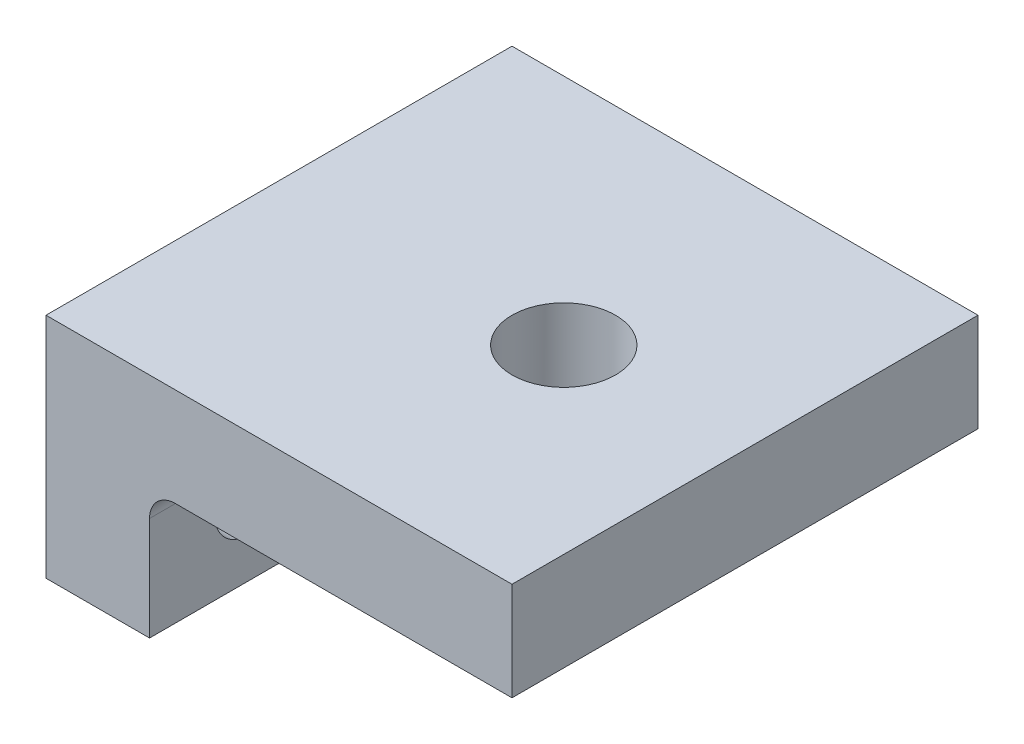
ISO-10303-21;
HEADER;
FILE_DESCRIPTION(('STEP AP214'),'2;1');
FILE_NAME('part.step','',(''),(''),'','','');
FILE_SCHEMA(('AUTOMOTIVE_DESIGN { 1 0 10303 214 1 1 1 1 }'));
ENDSEC;
DATA;
#1=APPLICATION_CONTEXT('core data for automotive mechanical design processes');
#2=APPLICATION_PROTOCOL_DEFINITION('international standard','automotive_design',2000,#1);
#3=PRODUCT_CONTEXT('',#1,'mechanical');
#4=PRODUCT('Part','Part','',(#3));
#5=PRODUCT_RELATED_PRODUCT_CATEGORY('part','',(#4));
#6=PRODUCT_DEFINITION_FORMATION('','',#4);
#7=PRODUCT_DEFINITION_CONTEXT('part definition',#1,'design');
#8=PRODUCT_DEFINITION('design','',#6,#7);
#9=PRODUCT_DEFINITION_SHAPE('','',#8);
#10=(LENGTH_UNIT() NAMED_UNIT(*) SI_UNIT(.MILLI.,.METRE.));
#11=(NAMED_UNIT(*) PLANE_ANGLE_UNIT() SI_UNIT($,.RADIAN.));
#12=(NAMED_UNIT(*) SI_UNIT($,.STERADIAN.) SOLID_ANGLE_UNIT());
#13=UNCERTAINTY_MEASURE_WITH_UNIT(LENGTH_MEASURE(1.E-05),#10,'distance_accuracy_value','');
#14=(GEOMETRIC_REPRESENTATION_CONTEXT(3) GLOBAL_UNCERTAINTY_ASSIGNED_CONTEXT((#13)) GLOBAL_UNIT_ASSIGNED_CONTEXT((#10,
#11,#12)) REPRESENTATION_CONTEXT('',''));
#15=CARTESIAN_POINT('',(0.,0.,0.));
#16=DIRECTION('',(0.,0.,1.));
#17=DIRECTION('',(1.,0.,0.));
#18=AXIS2_PLACEMENT_3D('',#15,#16,#17);
#19=CARTESIAN_POINT('',(45.72,-15.24,36.1061));
#20=DIRECTION('',(-1.,0.,0.));
#21=DIRECTION('',(0.,-1.,0.));
#22=AXIS2_PLACEMENT_3D('',#19,#20,#21);
#23=CYLINDRICAL_SURFACE('',#22,1.5);
#24=CARTESIAN_POINT('',(0.,-15.24,36.1061));
#25=DIRECTION('',(-1.,0.,0.));
#26=DIRECTION('',(0.,-1.,0.));
#27=AXIS2_PLACEMENT_3D('',#24,#25,#26);
#28=CIRCLE('',#27,1.5);
#29=CARTESIAN_POINT('',(0.,-16.74,36.1061));
#30=VERTEX_POINT('',#29);
#31=EDGE_CURVE('E145',#30,#30,#28,.T.);
#32=ORIENTED_EDGE('',*,*,#31,.T.);
#33=EDGE_LOOP('',(#32));
#34=FACE_BOUND('',#33,.T.);
#35=CARTESIAN_POINT('',(7.62,-15.24,36.1061));
#36=DIRECTION('',(1.,0.,0.));
#37=DIRECTION('',(0.,1.,0.));
#38=AXIS2_PLACEMENT_3D('',#35,#36,#37);
#39=CIRCLE('',#38,1.5);
#40=CARTESIAN_POINT('',(7.62,-13.74,36.1061));
#41=VERTEX_POINT('',#40);
#42=EDGE_CURVE('E142',#41,#41,#39,.F.);
#43=ORIENTED_EDGE('',*,*,#42,.F.);
#44=EDGE_LOOP('',(#43));
#45=FACE_BOUND('',#44,.T.);
#46=ADVANCED_FACE('F39',(#34,#45),#23,.F.);
#47=CARTESIAN_POINT('',(0.,0.,45.72));
#48=DIRECTION('',(0.,-1.,0.));
#49=DIRECTION('',(0.,0.,-1.));
#50=AXIS2_PLACEMENT_3D('',#47,#48,#49);
#51=PLANE('',#50);
#52=CARTESIAN_POINT('',(27.94,0.,22.86));
#53=DIRECTION('',(0.,1.,0.));
#54=DIRECTION('',(0.,0.,1.));
#55=AXIS2_PLACEMENT_3D('',#52,#53,#54);
#56=CIRCLE('',#55,5.08000000000001);
#57=CARTESIAN_POINT('',(27.94,0.,27.94));
#58=VERTEX_POINT('',#57);
#59=EDGE_CURVE('E378',#58,#58,#56,.T.);
#60=ORIENTED_EDGE('',*,*,#59,.F.);
#61=EDGE_LOOP('',(#60));
#62=FACE_BOUND('',#61,.T.);
#63=DIRECTION('',(-1.,0.,0.));
#64=VECTOR('',#63,1.);
#65=CARTESIAN_POINT('',(0.,0.,0.));
#66=LINE('',#65,#64);
#67=CARTESIAN_POINT('',(45.72,0.,0.));
#68=VERTEX_POINT('',#67);
#69=CARTESIAN_POINT('',(0.,0.,0.));
#70=VERTEX_POINT('',#69);
#71=EDGE_CURVE('E154',#68,#70,#66,.T.);
#72=ORIENTED_EDGE('',*,*,#71,.T.);
#73=DIRECTION('',(0.,0.,-1.));
#74=VECTOR('',#73,1.);
#75=CARTESIAN_POINT('',(0.,0.,45.72));
#76=LINE('',#75,#74);
#77=CARTESIAN_POINT('',(0.,0.,45.72));
#78=VERTEX_POINT('',#77);
#79=EDGE_CURVE('E195',#78,#70,#76,.T.);
#80=ORIENTED_EDGE('',*,*,#79,.F.);
#81=DIRECTION('',(-1.,0.,0.));
#82=VECTOR('',#81,1.);
#83=CARTESIAN_POINT('',(0.,0.,45.72));
#84=LINE('',#83,#82);
#85=CARTESIAN_POINT('',(45.72,0.,45.72));
#86=VERTEX_POINT('',#85);
#87=EDGE_CURVE('E158',#86,#78,#84,.T.);
#88=ORIENTED_EDGE('',*,*,#87,.F.);
#89=DIRECTION('',(0.,0.,-1.));
#90=VECTOR('',#89,1.);
#91=CARTESIAN_POINT('',(45.72,0.,45.72));
#92=LINE('',#91,#90);
#93=EDGE_CURVE('E173',#86,#68,#92,.T.);
#94=ORIENTED_EDGE('',*,*,#93,.T.);
#95=EDGE_LOOP('',(#72,#80,#88,#94));
#96=FACE_BOUND('',#95,.T.);
#97=ADVANCED_FACE('F223',(#62,#96),#51,.F.);
#98=CARTESIAN_POINT('',(0.,0.,45.72));
#99=DIRECTION('',(1.,0.,0.));
#100=DIRECTION('',(0.,1.,0.));
#101=AXIS2_PLACEMENT_3D('',#98,#99,#100);
#102=PLANE('',#101);
#103=CARTESIAN_POINT('',(0.,-15.24,9.6139));
#104=DIRECTION('',(-1.,0.,0.));
#105=DIRECTION('',(0.,-1.,0.));
#106=AXIS2_PLACEMENT_3D('',#103,#104,#105);
#107=CIRCLE('',#106,1.5);
#108=CARTESIAN_POINT('',(0.,-16.74,9.6139));
#109=VERTEX_POINT('',#108);
#110=EDGE_CURVE('E149',#109,#109,#107,.T.);
#111=ORIENTED_EDGE('',*,*,#110,.F.);
#112=EDGE_LOOP('',(#111));
#113=FACE_BOUND('',#112,.T.);
#114=ORIENTED_EDGE('',*,*,#31,.F.);
#115=EDGE_LOOP('',(#114));
#116=FACE_BOUND('',#115,.T.);
#117=DIRECTION('',(0.,-1.,0.));
#118=VECTOR('',#117,1.);
#119=CARTESIAN_POINT('',(0.,0.,0.));
#120=LINE('',#119,#118);
#121=CARTESIAN_POINT('',(0.,-22.352,0.));
#122=VERTEX_POINT('',#121);
#123=EDGE_CURVE('E176',#70,#122,#120,.T.);
#124=ORIENTED_EDGE('',*,*,#123,.T.);
#125=DIRECTION('',(0.,0.,-1.));
#126=VECTOR('',#125,1.);
#127=CARTESIAN_POINT('',(0.,-22.352,45.72));
#128=LINE('',#127,#126);
#129=CARTESIAN_POINT('',(0.,-22.352,45.72));
#130=VERTEX_POINT('',#129);
#131=EDGE_CURVE('E193',#130,#122,#128,.T.);
#132=ORIENTED_EDGE('',*,*,#131,.F.);
#133=DIRECTION('',(0.,-1.,0.));
#134=VECTOR('',#133,1.);
#135=CARTESIAN_POINT('',(0.,0.,45.72));
#136=LINE('',#135,#134);
#137=EDGE_CURVE('E161',#78,#130,#136,.T.);
#138=ORIENTED_EDGE('',*,*,#137,.F.);
#139=ORIENTED_EDGE('',*,*,#79,.T.);
#140=EDGE_LOOP('',(#124,#132,#138,#139));
#141=FACE_BOUND('',#140,.T.);
#142=ADVANCED_FACE('F218',(#113,#116,#141),#102,.F.);
#143=CARTESIAN_POINT('',(10.16,-22.352,45.72));
#144=DIRECTION('',(0.,1.,0.));
#145=DIRECTION('',(-1.,0.,0.));
#146=AXIS2_PLACEMENT_3D('',#143,#144,#145);
#147=PLANE('',#146);
#148=DIRECTION('',(1.,0.,0.));
#149=VECTOR('',#148,1.);
#150=CARTESIAN_POINT('',(10.16,-22.352,0.));
#151=LINE('',#150,#149);
#152=CARTESIAN_POINT('',(10.16,-22.352,0.));
#153=VERTEX_POINT('',#152);
#154=EDGE_CURVE('E178',#122,#153,#151,.T.);
#155=ORIENTED_EDGE('',*,*,#154,.T.);
#156=DIRECTION('',(0.,0.,-1.));
#157=VECTOR('',#156,1.);
#158=CARTESIAN_POINT('',(10.16,-22.352,45.72));
#159=LINE('',#158,#157);
#160=CARTESIAN_POINT('',(10.16,-22.352,45.72));
#161=VERTEX_POINT('',#160);
#162=EDGE_CURVE('E190',#161,#153,#159,.T.);
#163=ORIENTED_EDGE('',*,*,#162,.F.);
#164=DIRECTION('',(1.,0.,0.));
#165=VECTOR('',#164,1.);
#166=CARTESIAN_POINT('',(10.16,-22.352,45.72));
#167=LINE('',#166,#165);
#168=EDGE_CURVE('E164',#130,#161,#167,.T.);
#169=ORIENTED_EDGE('',*,*,#168,.F.);
#170=ORIENTED_EDGE('',*,*,#131,.T.);
#171=EDGE_LOOP('',(#155,#163,#169,#170));
#172=FACE_BOUND('',#171,.T.);
#173=ADVANCED_FACE('F216',(#172),#147,.F.);
#174=CARTESIAN_POINT('',(10.16,-9.652,45.72));
#175=DIRECTION('',(-1.,0.,0.));
#176=DIRECTION('',(0.,-1.,0.));
#177=AXIS2_PLACEMENT_3D('',#174,#175,#176);
#178=PLANE('',#177);
#179=DIRECTION('',(0.,0.,-1.));
#180=VECTOR('',#179,1.);
#181=CARTESIAN_POINT('',(10.16,-12.192,45.72));
#182=LINE('',#181,#180);
#183=CARTESIAN_POINT('',(10.16,-12.192,10.5029));
#184=VERTEX_POINT('',#183);
#185=CARTESIAN_POINT('',(10.16,-12.192,35.2171));
#186=VERTEX_POINT('',#185);
#187=EDGE_CURVE('E117',#184,#186,#182,.F.);
#188=ORIENTED_EDGE('',*,*,#187,.T.);
#189=CARTESIAN_POINT('',(10.16,-15.24,36.1061));
#190=DIRECTION('',(1.,0.,0.));
#191=DIRECTION('',(0.,1.,0.));
#192=AXIS2_PLACEMENT_3D('',#189,#190,#191);
#193=CIRCLE('',#192,3.175);
#194=CARTESIAN_POINT('',(10.16,-12.192,36.9951));
#195=VERTEX_POINT('',#194);
#196=EDGE_CURVE('E55',#195,#186,#193,.T.);
#197=ORIENTED_EDGE('',*,*,#196,.F.);
#198=CARTESIAN_POINT('',(10.16,-12.192,45.72));
#199=VERTEX_POINT('',#198);
#200=EDGE_CURVE('E134',#195,#199,#182,.F.);
#201=ORIENTED_EDGE('',*,*,#200,.T.);
#202=DIRECTION('',(0.,1.,0.));
#203=VECTOR('',#202,1.);
#204=CARTESIAN_POINT('',(10.16,-9.652,45.72));
#205=LINE('',#204,#203);
#206=EDGE_CURVE('E166',#161,#199,#205,.T.);
#207=ORIENTED_EDGE('',*,*,#206,.F.);
#208=ORIENTED_EDGE('',*,*,#162,.T.);
#209=DIRECTION('',(0.,1.,0.));
#210=VECTOR('',#209,1.);
#211=CARTESIAN_POINT('',(10.16,-9.652,0.));
#212=LINE('',#211,#210);
#213=CARTESIAN_POINT('',(10.16,-12.192,0.));
#214=VERTEX_POINT('',#213);
#215=EDGE_CURVE('E180',#153,#214,#212,.T.);
#216=ORIENTED_EDGE('',*,*,#215,.T.);
#217=CARTESIAN_POINT('',(10.16,-12.192,8.72489999999999));
#218=VERTEX_POINT('',#217);
#219=EDGE_CURVE('E116',#214,#218,#182,.F.);
#220=ORIENTED_EDGE('',*,*,#219,.T.);
#221=CARTESIAN_POINT('',(10.16,-15.24,9.6139));
#222=DIRECTION('',(1.,0.,0.));
#223=DIRECTION('',(0.,-1.,0.));
#224=AXIS2_PLACEMENT_3D('',#221,#222,#223);
#225=CIRCLE('',#224,3.175);
#226=EDGE_CURVE('E122',#184,#218,#225,.T.);
#227=ORIENTED_EDGE('',*,*,#226,.F.);
#228=EDGE_LOOP('',(#188,#197,#201,#207,#208,#216,#220,#227));
#229=FACE_BOUND('',#228,.T.);
#230=ADVANCED_FACE('F127',(#229),#178,.F.);
#231=CARTESIAN_POINT('',(45.72,-9.652,45.72));
#232=DIRECTION('',(0.,1.,0.));
#233=DIRECTION('',(-1.,0.,0.));
#234=AXIS2_PLACEMENT_3D('',#231,#232,#233);
#235=PLANE('',#234);
#236=CARTESIAN_POINT('',(27.94,-9.652,22.86));
#237=DIRECTION('',(0.,1.,0.));
#238=DIRECTION('',(-1.,0.,0.));
#239=AXIS2_PLACEMENT_3D('',#236,#237,#238);
#240=CIRCLE('',#239,5.08000000000001);
#241=CARTESIAN_POINT('',(22.86,-9.652,22.86));
#242=VERTEX_POINT('',#241);
#243=EDGE_CURVE('E43',#242,#242,#240,.T.);
#244=ORIENTED_EDGE('',*,*,#243,.T.);
#245=EDGE_LOOP('',(#244));
#246=FACE_BOUND('',#245,.T.);
#247=DIRECTION('',(1.,0.,0.));
#248=VECTOR('',#247,1.);
#249=CARTESIAN_POINT('',(45.72,-9.652,45.72));
#250=LINE('',#249,#248);
#251=CARTESIAN_POINT('',(12.7,-9.652,45.72));
#252=VERTEX_POINT('',#251);
#253=CARTESIAN_POINT('',(45.72,-9.652,45.72));
#254=VERTEX_POINT('',#253);
#255=EDGE_CURVE('E169',#252,#254,#250,.T.);
#256=ORIENTED_EDGE('',*,*,#255,.F.);
#257=DIRECTION('',(0.,0.,-1.));
#258=VECTOR('',#257,1.);
#259=CARTESIAN_POINT('',(12.7,-9.652,0.));
#260=LINE('',#259,#258);
#261=CARTESIAN_POINT('',(12.7,-9.652,0.));
#262=VERTEX_POINT('',#261);
#263=EDGE_CURVE('E137',#252,#262,#260,.T.);
#264=ORIENTED_EDGE('',*,*,#263,.T.);
#265=DIRECTION('',(1.,0.,0.));
#266=VECTOR('',#265,1.);
#267=CARTESIAN_POINT('',(45.72,-9.652,0.));
#268=LINE('',#267,#266);
#269=CARTESIAN_POINT('',(45.72,-9.652,0.));
#270=VERTEX_POINT('',#269);
#271=EDGE_CURVE('E182',#262,#270,#268,.T.);
#272=ORIENTED_EDGE('',*,*,#271,.T.);
#273=DIRECTION('',(0.,0.,-1.));
#274=VECTOR('',#273,1.);
#275=CARTESIAN_POINT('',(45.72,-9.652,45.72));
#276=LINE('',#275,#274);
#277=EDGE_CURVE('E187',#254,#270,#276,.T.);
#278=ORIENTED_EDGE('',*,*,#277,.F.);
#279=EDGE_LOOP('',(#256,#264,#272,#278));
#280=FACE_BOUND('',#279,.T.);
#281=ADVANCED_FACE('F227',(#246,#280),#235,.F.);
#282=CARTESIAN_POINT('',(45.72,0.,45.72));
#283=DIRECTION('',(-1.,0.,0.));
#284=DIRECTION('',(0.,0.,1.));
#285=AXIS2_PLACEMENT_3D('',#282,#283,#284);
#286=PLANE('',#285);
#287=DIRECTION('',(0.,1.,0.));
#288=VECTOR('',#287,1.);
#289=CARTESIAN_POINT('',(45.72,0.,0.));
#290=LINE('',#289,#288);
#291=EDGE_CURVE('E162',#270,#68,#290,.T.);
#292=ORIENTED_EDGE('',*,*,#291,.T.);
#293=ORIENTED_EDGE('',*,*,#93,.F.);
#294=DIRECTION('',(0.,1.,0.));
#295=VECTOR('',#294,1.);
#296=CARTESIAN_POINT('',(45.72,0.,45.72));
#297=LINE('',#296,#295);
#298=EDGE_CURVE('E171',#254,#86,#297,.T.);
#299=ORIENTED_EDGE('',*,*,#298,.F.);
#300=ORIENTED_EDGE('',*,*,#277,.T.);
#301=EDGE_LOOP('',(#292,#293,#299,#300));
#302=FACE_BOUND('',#301,.T.);
#303=ADVANCED_FACE('F225',(#302),#286,.F.);
#304=CARTESIAN_POINT('',(0.,0.,45.72));
#305=DIRECTION('',(0.,0.,-1.));
#306=DIRECTION('',(-1.,0.,0.));
#307=AXIS2_PLACEMENT_3D('',#304,#305,#306);
#308=PLANE('',#307);
#309=ORIENTED_EDGE('',*,*,#87,.T.);
#310=ORIENTED_EDGE('',*,*,#137,.T.);
#311=ORIENTED_EDGE('',*,*,#168,.T.);
#312=ORIENTED_EDGE('',*,*,#206,.T.);
#313=CARTESIAN_POINT('',(12.7,-12.192,45.72));
#314=DIRECTION('',(0.,0.,-1.));
#315=DIRECTION('',(-1.,0.,0.));
#316=AXIS2_PLACEMENT_3D('',#313,#314,#315);
#317=CIRCLE('',#316,2.54);
#318=EDGE_CURVE('E11',#199,#252,#317,.T.);
#319=ORIENTED_EDGE('',*,*,#318,.T.);
#320=ORIENTED_EDGE('',*,*,#255,.T.);
#321=ORIENTED_EDGE('',*,*,#298,.T.);
#322=EDGE_LOOP('',(#309,#310,#311,#312,#319,#320,#321));
#323=FACE_BOUND('',#322,.T.);
#324=ADVANCED_FACE('F206',(#323),#308,.F.);
#325=CARTESIAN_POINT('',(0.,0.,0.));
#326=DIRECTION('',(0.,0.,-1.));
#327=DIRECTION('',(-1.,0.,0.));
#328=AXIS2_PLACEMENT_3D('',#325,#326,#327);
#329=PLANE('',#328);
#330=ORIENTED_EDGE('',*,*,#71,.F.);
#331=ORIENTED_EDGE('',*,*,#291,.F.);
#332=ORIENTED_EDGE('',*,*,#271,.F.);
#333=CARTESIAN_POINT('',(12.7,-12.192,0.));
#334=DIRECTION('',(0.,0.,-1.));
#335=DIRECTION('',(-1.,0.,0.));
#336=AXIS2_PLACEMENT_3D('',#333,#334,#335);
#337=CIRCLE('',#336,2.54);
#338=EDGE_CURVE('E48',#262,#214,#337,.F.);
#339=ORIENTED_EDGE('',*,*,#338,.T.);
#340=ORIENTED_EDGE('',*,*,#215,.F.);
#341=ORIENTED_EDGE('',*,*,#154,.F.);
#342=ORIENTED_EDGE('',*,*,#123,.F.);
#343=EDGE_LOOP('',(#330,#331,#332,#339,#340,#341,#342));
#344=FACE_BOUND('',#343,.T.);
#345=ADVANCED_FACE('F212',(#344),#329,.T.);
#346=CARTESIAN_POINT('',(45.72,-15.24,9.6139));
#347=DIRECTION('',(-1.,0.,0.));
#348=DIRECTION('',(0.,-1.,0.));
#349=AXIS2_PLACEMENT_3D('',#346,#347,#348);
#350=CYLINDRICAL_SURFACE('',#349,1.5);
#351=CARTESIAN_POINT('',(7.62,-15.24,9.6139));
#352=DIRECTION('',(-1.,0.,0.));
#353=DIRECTION('',(0.,-1.,0.));
#354=AXIS2_PLACEMENT_3D('',#351,#352,#353);
#355=CIRCLE('',#354,1.5);
#356=CARTESIAN_POINT('',(7.62,-16.74,9.6139));
#357=VERTEX_POINT('',#356);
#358=EDGE_CURVE('E140',#357,#357,#355,.F.);
#359=ORIENTED_EDGE('',*,*,#358,.T.);
#360=EDGE_LOOP('',(#359));
#361=FACE_BOUND('',#360,.T.);
#362=ORIENTED_EDGE('',*,*,#110,.T.);
#363=EDGE_LOOP('',(#362));
#364=FACE_BOUND('',#363,.T.);
#365=ADVANCED_FACE('F249',(#361,#364),#350,.F.);
#366=CARTESIAN_POINT('',(12.7,-12.192,45.72));
#367=DIRECTION('',(0.,0.,1.));
#368=DIRECTION('',(1.,0.,0.));
#369=AXIS2_PLACEMENT_3D('',#366,#367,#368);
#370=CYLINDRICAL_SURFACE('',#369,2.54);
#371=ORIENTED_EDGE('',*,*,#318,.F.);
#372=ORIENTED_EDGE('',*,*,#200,.F.);
#373=EDGE_CURVE('E133',#186,#195,#182,.F.);
#374=ORIENTED_EDGE('',*,*,#373,.F.);
#375=ORIENTED_EDGE('',*,*,#187,.F.);
#376=EDGE_CURVE('E110',#218,#184,#182,.F.);
#377=ORIENTED_EDGE('',*,*,#376,.F.);
#378=ORIENTED_EDGE('',*,*,#219,.F.);
#379=ORIENTED_EDGE('',*,*,#338,.F.);
#380=ORIENTED_EDGE('',*,*,#263,.F.);
#381=EDGE_LOOP('',(#371,#372,#374,#375,#377,#378,#379,#380));
#382=FACE_BOUND('',#381,.T.);
#383=ADVANCED_FACE('F41',(#382),#370,.F.);
#384=CARTESIAN_POINT('',(7.62,-15.24,9.6139));
#385=DIRECTION('',(-1.,0.,0.));
#386=DIRECTION('',(0.,-1.,0.));
#387=AXIS2_PLACEMENT_3D('',#384,#385,#386);
#388=PLANE('',#387);
#389=CARTESIAN_POINT('',(7.62,-15.24,9.6139));
#390=DIRECTION('',(1.,0.,0.));
#391=DIRECTION('',(0.,-1.,0.));
#392=AXIS2_PLACEMENT_3D('',#389,#390,#391);
#393=CIRCLE('',#392,3.175);
#394=CARTESIAN_POINT('',(7.62,-18.415,9.6139));
#395=VERTEX_POINT('',#394);
#396=EDGE_CURVE('E129',#395,#395,#393,.T.);
#397=ORIENTED_EDGE('',*,*,#396,.T.);
#398=EDGE_LOOP('',(#397));
#399=FACE_BOUND('',#398,.T.);
#400=ORIENTED_EDGE('',*,*,#358,.F.);
#401=EDGE_LOOP('',(#400));
#402=FACE_BOUND('',#401,.T.);
#403=ADVANCED_FACE('F260',(#399,#402),#388,.F.);
#404=CARTESIAN_POINT('',(7.62,-15.24,9.6139));
#405=DIRECTION('',(1.,0.,0.));
#406=DIRECTION('',(0.,1.,0.));
#407=AXIS2_PLACEMENT_3D('',#404,#405,#406);
#408=CYLINDRICAL_SURFACE('',#407,3.175);
#409=ORIENTED_EDGE('',*,*,#396,.F.);
#410=EDGE_LOOP('',(#409));
#411=FACE_BOUND('',#410,.T.);
#412=EDGE_CURVE('E62',#218,#184,#225,.T.);
#413=ORIENTED_EDGE('',*,*,#412,.T.);
#414=ORIENTED_EDGE('',*,*,#226,.T.);
#415=EDGE_LOOP('',(#413,#414));
#416=FACE_BOUND('',#415,.T.);
#417=ADVANCED_FACE('F121',(#411,#416),#408,.F.);
#418=CARTESIAN_POINT('',(10.16,-15.24,9.6139));
#419=DIRECTION('',(-1.,0.,0.));
#420=DIRECTION('',(0.,-1.,0.));
#421=AXIS2_PLACEMENT_3D('',#418,#419,#420);
#422=PLANE('',#421);
#423=ORIENTED_EDGE('',*,*,#412,.F.);
#424=ORIENTED_EDGE('',*,*,#376,.T.);
#425=EDGE_LOOP('',(#423,#424));
#426=FACE_BOUND('',#425,.T.);
#427=ADVANCED_FACE('F111',(#426),#422,.T.);
#428=CARTESIAN_POINT('',(7.62,-15.24,36.1061));
#429=DIRECTION('',(1.,0.,0.));
#430=DIRECTION('',(0.,1.,0.));
#431=AXIS2_PLACEMENT_3D('',#428,#429,#430);
#432=PLANE('',#431);
#433=CARTESIAN_POINT('',(7.62,-15.24,36.1061));
#434=DIRECTION('',(1.,0.,0.));
#435=DIRECTION('',(0.,1.,0.));
#436=AXIS2_PLACEMENT_3D('',#433,#434,#435);
#437=CIRCLE('',#436,3.175);
#438=CARTESIAN_POINT('',(7.62,-12.065,36.1061));
#439=VERTEX_POINT('',#438);
#440=EDGE_CURVE('E143',#439,#439,#437,.T.);
#441=ORIENTED_EDGE('',*,*,#440,.T.);
#442=EDGE_LOOP('',(#441));
#443=FACE_BOUND('',#442,.T.);
#444=ORIENTED_EDGE('',*,*,#42,.T.);
#445=EDGE_LOOP('',(#444));
#446=FACE_BOUND('',#445,.T.);
#447=ADVANCED_FACE('F334',(#443,#446),#432,.T.);
#448=CARTESIAN_POINT('',(10.16,-15.24,36.1061));
#449=DIRECTION('',(1.,0.,0.));
#450=DIRECTION('',(0.,1.,0.));
#451=AXIS2_PLACEMENT_3D('',#448,#449,#450);
#452=PLANE('',#451);
#453=EDGE_CURVE('E123',#186,#195,#193,.T.);
#454=ORIENTED_EDGE('',*,*,#453,.F.);
#455=ORIENTED_EDGE('',*,*,#373,.T.);
#456=EDGE_LOOP('',(#454,#455));
#457=FACE_BOUND('',#456,.T.);
#458=ADVANCED_FACE('F343',(#457),#452,.F.);
#459=CARTESIAN_POINT('',(7.62,-15.24,36.1061));
#460=DIRECTION('',(1.,0.,0.));
#461=DIRECTION('',(0.,1.,0.));
#462=AXIS2_PLACEMENT_3D('',#459,#460,#461);
#463=CYLINDRICAL_SURFACE('',#462,3.175);
#464=ORIENTED_EDGE('',*,*,#440,.F.);
#465=EDGE_LOOP('',(#464));
#466=FACE_BOUND('',#465,.T.);
#467=ORIENTED_EDGE('',*,*,#196,.T.);
#468=ORIENTED_EDGE('',*,*,#453,.T.);
#469=EDGE_LOOP('',(#467,#468));
#470=FACE_BOUND('',#469,.T.);
#471=ADVANCED_FACE('F353',(#466,#470),#463,.F.);
#472=CARTESIAN_POINT('',(27.94,-22.352,22.86));
#473=DIRECTION('',(0.,1.,0.));
#474=DIRECTION('',(0.,0.,1.));
#475=AXIS2_PLACEMENT_3D('',#472,#473,#474);
#476=CYLINDRICAL_SURFACE('',#475,5.08000000000001);
#477=ORIENTED_EDGE('',*,*,#59,.T.);
#478=EDGE_LOOP('',(#477));
#479=FACE_BOUND('',#478,.T.);
#480=ORIENTED_EDGE('',*,*,#243,.F.);
#481=EDGE_LOOP('',(#480));
#482=FACE_BOUND('',#481,.T.);
#483=ADVANCED_FACE('F363',(#479,#482),#476,.F.);
#484=CLOSED_SHELL('',(#46,#97,#142,#173,#230,#281,#303,#324,#345,#365,#383,#403,#417,#427,#447,
#458,#471,#483));
#485=MANIFOLD_SOLID_BREP('B2',#484);
#486=ADVANCED_BREP_SHAPE_REPRESENTATION('',(#18,#485),#14);
#487=SHAPE_DEFINITION_REPRESENTATION(#9,#486);
ENDSEC;
END-ISO-10303-21;
